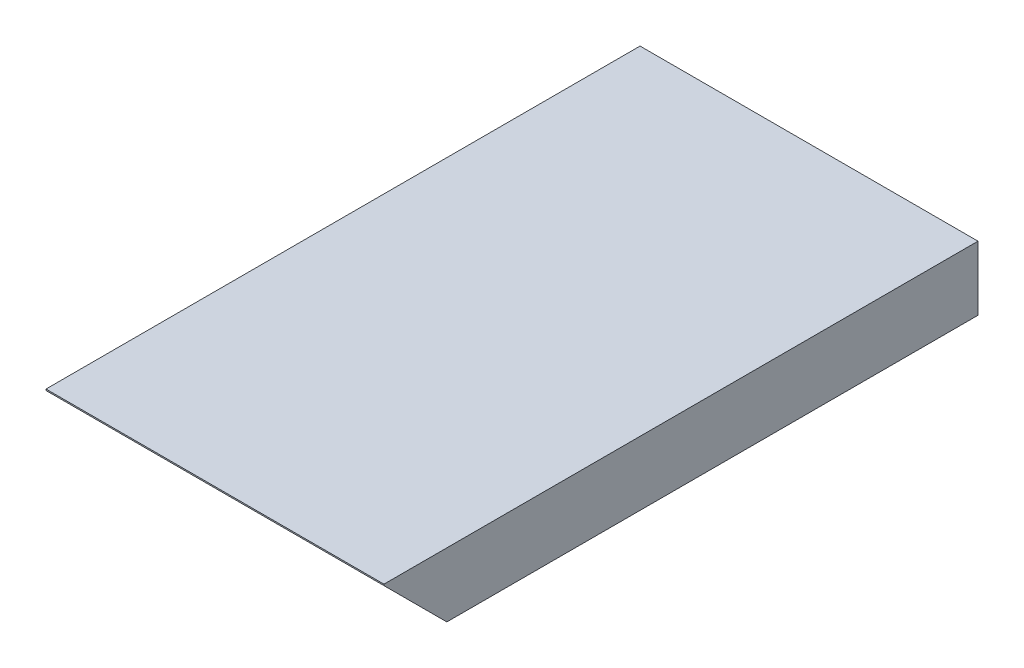
ISO-10303-21;
HEADER;
FILE_DESCRIPTION(('STEP AP214'),'2;1');
FILE_NAME('part.step','',(''),(''),'','','');
FILE_SCHEMA(('AUTOMOTIVE_DESIGN { 1 0 10303 214 1 1 1 1 }'));
ENDSEC;
DATA;
#1=APPLICATION_CONTEXT('core data for automotive mechanical design processes');
#2=APPLICATION_PROTOCOL_DEFINITION('international standard','automotive_design',2000,#1);
#3=PRODUCT_CONTEXT('',#1,'mechanical');
#4=PRODUCT('Part','Part','',(#3));
#5=PRODUCT_RELATED_PRODUCT_CATEGORY('part','',(#4));
#6=PRODUCT_DEFINITION_FORMATION('','',#4);
#7=PRODUCT_DEFINITION_CONTEXT('part definition',#1,'design');
#8=PRODUCT_DEFINITION('design','',#6,#7);
#9=PRODUCT_DEFINITION_SHAPE('','',#8);
#10=(LENGTH_UNIT() NAMED_UNIT(*) SI_UNIT(.MILLI.,.METRE.));
#11=(NAMED_UNIT(*) PLANE_ANGLE_UNIT() SI_UNIT($,.RADIAN.));
#12=(NAMED_UNIT(*) SI_UNIT($,.STERADIAN.) SOLID_ANGLE_UNIT());
#13=UNCERTAINTY_MEASURE_WITH_UNIT(LENGTH_MEASURE(1.E-05),#10,'distance_accuracy_value','');
#14=(GEOMETRIC_REPRESENTATION_CONTEXT(3) GLOBAL_UNCERTAINTY_ASSIGNED_CONTEXT((#13)) GLOBAL_UNIT_ASSIGNED_CONTEXT((#10,
#11,#12)) REPRESENTATION_CONTEXT('',''));
#15=CARTESIAN_POINT('',(0.,0.,0.));
#16=DIRECTION('',(0.,0.,1.));
#17=DIRECTION('',(1.,0.,0.));
#18=AXIS2_PLACEMENT_3D('',#15,#16,#17);
#19=CARTESIAN_POINT('',(-12.9,4.9,-24.));
#20=DIRECTION('',(1.,0.,0.));
#21=DIRECTION('',(0.,0.,-1.));
#22=AXIS2_PLACEMENT_3D('',#19,#20,#21);
#23=PLANE('',#22);
#24=DIRECTION('',(0.,0.,1.));
#25=VECTOR('',#24,1.);
#26=CARTESIAN_POINT('',(-12.9,0.,-24.));
#27=LINE('',#26,#25);
#28=CARTESIAN_POINT('',(-12.9,0.,-24.));
#29=VERTEX_POINT('',#28);
#30=CARTESIAN_POINT('',(-12.9,0.,16.5492424049174));
#31=VERTEX_POINT('',#30);
#32=EDGE_CURVE('E113',#29,#31,#27,.T.);
#33=ORIENTED_EDGE('',*,*,#32,.T.);
#34=DIRECTION('',(0.,-0.707106781186546,-0.707106781186549));
#35=VECTOR('',#34,1.);
#36=CARTESIAN_POINT('',(-12.9,4.79999999999999,21.3492424049175));
#37=LINE('',#36,#35);
#38=CARTESIAN_POINT('',(-12.9,4.79999999999999,21.3492424049175));
#39=VERTEX_POINT('',#38);
#40=EDGE_CURVE('E11',#31,#39,#37,.F.);
#41=ORIENTED_EDGE('',*,*,#40,.T.);
#42=DIRECTION('',(0.,-1.,0.));
#43=VECTOR('',#42,1.);
#44=CARTESIAN_POINT('',(-12.9,4.9,21.3492424049175));
#45=LINE('',#44,#43);
#46=CARTESIAN_POINT('',(-12.9,4.9,21.3492424049175));
#47=VERTEX_POINT('',#46);
#48=EDGE_CURVE('E81',#47,#39,#45,.T.);
#49=ORIENTED_EDGE('',*,*,#48,.F.);
#50=DIRECTION('',(0.,0.,1.));
#51=VECTOR('',#50,1.);
#52=CARTESIAN_POINT('',(-12.9,4.9,-24.));
#53=LINE('',#52,#51);
#54=CARTESIAN_POINT('',(-12.9,4.9,-24.));
#55=VERTEX_POINT('',#54);
#56=EDGE_CURVE('E87',#55,#47,#53,.T.);
#57=ORIENTED_EDGE('',*,*,#56,.F.);
#58=DIRECTION('',(0.,-1.,0.));
#59=VECTOR('',#58,1.);
#60=CARTESIAN_POINT('',(-12.9,4.9,-24.));
#61=LINE('',#60,#59);
#62=EDGE_CURVE('E108',#55,#29,#61,.T.);
#63=ORIENTED_EDGE('',*,*,#62,.T.);
#64=EDGE_LOOP('',(#33,#41,#49,#57,#63));
#65=FACE_BOUND('',#64,.T.);
#66=ADVANCED_FACE('F30',(#65),#23,.F.);
#67=CARTESIAN_POINT('',(-12.9,4.9,21.3492424049175));
#68=DIRECTION('',(0.,0.,-1.));
#69=DIRECTION('',(-1.,0.,0.));
#70=AXIS2_PLACEMENT_3D('',#67,#68,#69);
#71=PLANE('',#70);
#72=ORIENTED_EDGE('',*,*,#48,.T.);
#73=DIRECTION('',(1.,0.,0.));
#74=VECTOR('',#73,1.);
#75=CARTESIAN_POINT('',(-12.9,4.79999999999999,21.3492424049175));
#76=LINE('',#75,#74);
#77=CARTESIAN_POINT('',(12.9,4.79999999999999,21.3492424049175));
#78=VERTEX_POINT('',#77);
#79=EDGE_CURVE('E99',#39,#78,#76,.T.);
#80=ORIENTED_EDGE('',*,*,#79,.T.);
#81=DIRECTION('',(0.,-1.,0.));
#82=VECTOR('',#81,1.);
#83=CARTESIAN_POINT('',(12.9,4.9,21.3492424049175));
#84=LINE('',#83,#82);
#85=CARTESIAN_POINT('',(12.9,4.9,21.3492424049175));
#86=VERTEX_POINT('',#85);
#87=EDGE_CURVE('E83',#86,#78,#84,.T.);
#88=ORIENTED_EDGE('',*,*,#87,.F.);
#89=DIRECTION('',(1.,0.,0.));
#90=VECTOR('',#89,1.);
#91=CARTESIAN_POINT('',(-12.9,4.9,21.3492424049175));
#92=LINE('',#91,#90);
#93=EDGE_CURVE('E76',#47,#86,#92,.T.);
#94=ORIENTED_EDGE('',*,*,#93,.F.);
#95=EDGE_LOOP('',(#72,#80,#88,#94));
#96=FACE_BOUND('',#95,.T.);
#97=ADVANCED_FACE('F78',(#96),#71,.F.);
#98=CARTESIAN_POINT('',(12.9,4.9,-24.));
#99=DIRECTION('',(-1.,0.,0.));
#100=DIRECTION('',(0.,0.,1.));
#101=AXIS2_PLACEMENT_3D('',#98,#99,#100);
#102=PLANE('',#101);
#103=ORIENTED_EDGE('',*,*,#87,.T.);
#104=DIRECTION('',(0.,0.707106781186546,0.707106781186549));
#105=VECTOR('',#104,1.);
#106=CARTESIAN_POINT('',(12.9,4.79999999999999,21.3492424049175));
#107=LINE('',#106,#105);
#108=CARTESIAN_POINT('',(12.9,0.,16.5492424049174));
#109=VERTEX_POINT('',#108);
#110=EDGE_CURVE('E52',#78,#109,#107,.F.);
#111=ORIENTED_EDGE('',*,*,#110,.T.);
#112=DIRECTION('',(0.,0.,-1.));
#113=VECTOR('',#112,1.);
#114=CARTESIAN_POINT('',(12.9,0.,-24.));
#115=LINE('',#114,#113);
#116=CARTESIAN_POINT('',(12.9,0.,-24.));
#117=VERTEX_POINT('',#116);
#118=EDGE_CURVE('E111',#109,#117,#115,.T.);
#119=ORIENTED_EDGE('',*,*,#118,.T.);
#120=DIRECTION('',(0.,-1.,0.));
#121=VECTOR('',#120,1.);
#122=CARTESIAN_POINT('',(12.9,4.9,-24.));
#123=LINE('',#122,#121);
#124=CARTESIAN_POINT('',(12.9,4.9,-24.));
#125=VERTEX_POINT('',#124);
#126=EDGE_CURVE('E102',#125,#117,#123,.T.);
#127=ORIENTED_EDGE('',*,*,#126,.F.);
#128=DIRECTION('',(0.,0.,-1.));
#129=VECTOR('',#128,1.);
#130=CARTESIAN_POINT('',(12.9,4.9,-24.));
#131=LINE('',#130,#129);
#132=EDGE_CURVE('E86',#86,#125,#131,.T.);
#133=ORIENTED_EDGE('',*,*,#132,.F.);
#134=EDGE_LOOP('',(#103,#111,#119,#127,#133));
#135=FACE_BOUND('',#134,.T.);
#136=ADVANCED_FACE('F117',(#135),#102,.F.);
#137=CARTESIAN_POINT('',(-12.9,4.9,-24.));
#138=DIRECTION('',(0.,0.,1.));
#139=DIRECTION('',(1.,0.,0.));
#140=AXIS2_PLACEMENT_3D('',#137,#138,#139);
#141=PLANE('',#140);
#142=DIRECTION('',(-1.,0.,0.));
#143=VECTOR('',#142,1.);
#144=CARTESIAN_POINT('',(-12.9,0.,-24.));
#145=LINE('',#144,#143);
#146=EDGE_CURVE('E96',#117,#29,#145,.T.);
#147=ORIENTED_EDGE('',*,*,#146,.T.);
#148=ORIENTED_EDGE('',*,*,#62,.F.);
#149=DIRECTION('',(-1.,0.,0.));
#150=VECTOR('',#149,1.);
#151=CARTESIAN_POINT('',(-12.9,4.9,-24.));
#152=LINE('',#151,#150);
#153=EDGE_CURVE('E92',#125,#55,#152,.T.);
#154=ORIENTED_EDGE('',*,*,#153,.F.);
#155=ORIENTED_EDGE('',*,*,#126,.T.);
#156=EDGE_LOOP('',(#147,#148,#154,#155));
#157=FACE_BOUND('',#156,.T.);
#158=ADVANCED_FACE('F120',(#157),#141,.F.);
#159=CARTESIAN_POINT('',(-12.9,4.9,21.3492424049175));
#160=DIRECTION('',(0.,1.,0.));
#161=DIRECTION('',(0.,0.,1.));
#162=AXIS2_PLACEMENT_3D('',#159,#160,#161);
#163=PLANE('',#162);
#164=ORIENTED_EDGE('',*,*,#56,.T.);
#165=ORIENTED_EDGE('',*,*,#93,.T.);
#166=ORIENTED_EDGE('',*,*,#132,.T.);
#167=ORIENTED_EDGE('',*,*,#153,.T.);
#168=EDGE_LOOP('',(#164,#165,#166,#167));
#169=FACE_BOUND('',#168,.T.);
#170=ADVANCED_FACE('F90',(#169),#163,.T.);
#171=CARTESIAN_POINT('',(-12.9,0.,21.3492424049175));
#172=DIRECTION('',(0.,1.,0.));
#173=DIRECTION('',(0.,0.,1.));
#174=AXIS2_PLACEMENT_3D('',#171,#172,#173);
#175=PLANE('',#174);
#176=ORIENTED_EDGE('',*,*,#118,.F.);
#177=DIRECTION('',(-1.,0.,0.));
#178=VECTOR('',#177,1.);
#179=CARTESIAN_POINT('',(-12.9,0.,16.5492424049174));
#180=LINE('',#179,#178);
#181=EDGE_CURVE('E38',#109,#31,#180,.T.);
#182=ORIENTED_EDGE('',*,*,#181,.T.);
#183=ORIENTED_EDGE('',*,*,#32,.F.);
#184=ORIENTED_EDGE('',*,*,#146,.F.);
#185=EDGE_LOOP('',(#176,#182,#183,#184));
#186=FACE_BOUND('',#185,.T.);
#187=ADVANCED_FACE('F121',(#186),#175,.F.);
#188=CARTESIAN_POINT('',(-12.9,4.79999999999999,21.3492424049175));
#189=DIRECTION('',(0.,0.707106781186549,-0.707106781186546));
#190=DIRECTION('',(0.,0.707106781186546,0.707106781186549));
#191=AXIS2_PLACEMENT_3D('',#188,#189,#190);
#192=PLANE('',#191);
#193=ORIENTED_EDGE('',*,*,#40,.F.);
#194=ORIENTED_EDGE('',*,*,#181,.F.);
#195=ORIENTED_EDGE('',*,*,#110,.F.);
#196=ORIENTED_EDGE('',*,*,#79,.F.);
#197=EDGE_LOOP('',(#193,#194,#195,#196));
#198=FACE_BOUND('',#197,.T.);
#199=ADVANCED_FACE('F32',(#198),#192,.F.);
#200=CLOSED_SHELL('',(#66,#97,#136,#158,#170,#187,#199));
#201=MANIFOLD_SOLID_BREP('B2',#200);
#202=ADVANCED_BREP_SHAPE_REPRESENTATION('',(#18,#201),#14);
#203=SHAPE_DEFINITION_REPRESENTATION(#9,#202);
ENDSEC;
END-ISO-10303-21;
